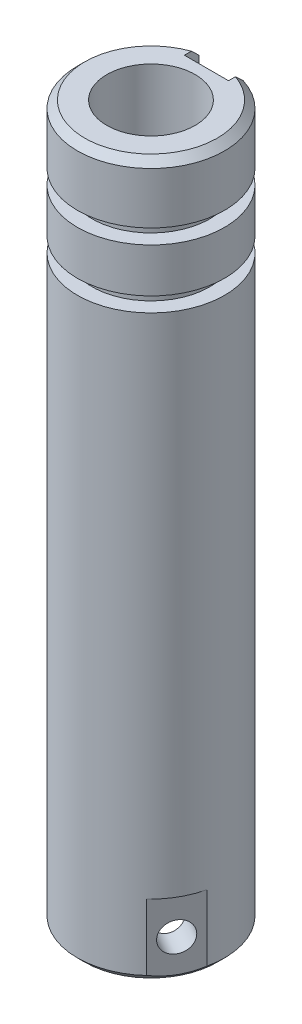
ISO-10303-21;
HEADER;
FILE_DESCRIPTION(('STEP AP214'),'2;1');
FILE_NAME('part.step','',(''),(''),'','','');
FILE_SCHEMA(('AUTOMOTIVE_DESIGN { 1 0 10303 214 1 1 1 1 }'));
ENDSEC;
DATA;
#1=APPLICATION_CONTEXT('core data for automotive mechanical design processes');
#2=APPLICATION_PROTOCOL_DEFINITION('international standard','automotive_design',2000,#1);
#3=PRODUCT_CONTEXT('',#1,'mechanical');
#4=PRODUCT('Part','Part','',(#3));
#5=PRODUCT_RELATED_PRODUCT_CATEGORY('part','',(#4));
#6=PRODUCT_DEFINITION_FORMATION('','',#4);
#7=PRODUCT_DEFINITION_CONTEXT('part definition',#1,'design');
#8=PRODUCT_DEFINITION('design','',#6,#7);
#9=PRODUCT_DEFINITION_SHAPE('','',#8);
#10=(LENGTH_UNIT() NAMED_UNIT(*) SI_UNIT(.MILLI.,.METRE.));
#11=(NAMED_UNIT(*) PLANE_ANGLE_UNIT() SI_UNIT($,.RADIAN.));
#12=(NAMED_UNIT(*) SI_UNIT($,.STERADIAN.) SOLID_ANGLE_UNIT());
#13=UNCERTAINTY_MEASURE_WITH_UNIT(LENGTH_MEASURE(1.E-05),#10,'distance_accuracy_value','');
#14=(GEOMETRIC_REPRESENTATION_CONTEXT(3) GLOBAL_UNCERTAINTY_ASSIGNED_CONTEXT((#13)) GLOBAL_UNIT_ASSIGNED_CONTEXT((#10,
#11,#12)) REPRESENTATION_CONTEXT('',''));
#15=CARTESIAN_POINT('',(0.,0.,0.));
#16=DIRECTION('',(0.,0.,1.));
#17=DIRECTION('',(1.,0.,0.));
#18=AXIS2_PLACEMENT_3D('',#15,#16,#17);
#19=CARTESIAN_POINT('',(0.,48.5,0.));
#20=DIRECTION('',(0.,-1.,0.));
#21=DIRECTION('',(0.,0.,-1.));
#22=AXIS2_PLACEMENT_3D('',#19,#20,#21);
#23=CYLINDRICAL_SURFACE('',#22,5.);
#24=DIRECTION('',(0.,1.,0.));
#25=VECTOR('',#24,1.);
#26=CARTESIAN_POINT('',(1.5,36.2575244156689,-4.76969600708473));
#27=LINE('',#26,#25);
#28=CARTESIAN_POINT('',(1.5,44.5,-4.76969600708473));
#29=VERTEX_POINT('',#28);
#30=CARTESIAN_POINT('',(1.5,48.,-4.76969600708473));
#31=VERTEX_POINT('',#30);
#32=EDGE_CURVE('E206',#29,#31,#27,.T.);
#33=ORIENTED_EDGE('',*,*,#32,.T.);
#34=CARTESIAN_POINT('',(0.,48.,0.));
#35=DIRECTION('',(0.,1.,0.));
#36=DIRECTION('',(0.,0.,1.));
#37=AXIS2_PLACEMENT_3D('',#34,#35,#36);
#38=CIRCLE('',#37,5.);
#39=CARTESIAN_POINT('',(-1.5,48.,-4.76969600708473));
#40=VERTEX_POINT('',#39);
#41=EDGE_CURVE('E47',#31,#40,#38,.F.);
#42=ORIENTED_EDGE('',*,*,#41,.T.);
#43=DIRECTION('',(0.,1.,0.));
#44=VECTOR('',#43,1.);
#45=CARTESIAN_POINT('',(-1.5,36.2575244156689,-4.76969600708473));
#46=LINE('',#45,#44);
#47=CARTESIAN_POINT('',(-1.5,44.5,-4.76969600708473));
#48=VERTEX_POINT('',#47);
#49=EDGE_CURVE('E209',#48,#40,#46,.T.);
#50=ORIENTED_EDGE('',*,*,#49,.F.);
#51=CARTESIAN_POINT('',(0.,44.5,0.));
#52=DIRECTION('',(0.,-1.,0.));
#53=DIRECTION('',(0.,0.,-1.));
#54=AXIS2_PLACEMENT_3D('',#51,#52,#53);
#55=CIRCLE('',#54,5.);
#56=EDGE_CURVE('E240',#29,#48,#55,.T.);
#57=ORIENTED_EDGE('',*,*,#56,.F.);
#58=EDGE_LOOP('',(#33,#42,#50,#57));
#59=FACE_BOUND('',#58,.T.);
#60=ADVANCED_FACE('F33',(#59),#23,.T.);
#61=CARTESIAN_POINT('',(0.,43.5,0.));
#62=DIRECTION('',(0.,-1.,0.));
#63=DIRECTION('',(0.,0.,-1.));
#64=AXIS2_PLACEMENT_3D('',#61,#62,#63);
#65=CIRCLE('',#64,5.);
#66=CARTESIAN_POINT('',(1.5,43.5,-4.76969600708473));
#67=VERTEX_POINT('',#66);
#68=CARTESIAN_POINT('',(-1.5,43.5,-4.76969600708473));
#69=VERTEX_POINT('',#68);
#70=EDGE_CURVE('E237',#67,#69,#65,.T.);
#71=ORIENTED_EDGE('',*,*,#70,.T.);
#72=CARTESIAN_POINT('',(-1.5,40.5,-4.76969600708473));
#73=VERTEX_POINT('',#72);
#74=EDGE_CURVE('E211',#73,#69,#46,.T.);
#75=ORIENTED_EDGE('',*,*,#74,.F.);
#76=CARTESIAN_POINT('',(0.,40.5,0.));
#77=DIRECTION('',(0.,-1.,0.));
#78=DIRECTION('',(0.,0.,-1.));
#79=AXIS2_PLACEMENT_3D('',#76,#77,#78);
#80=CIRCLE('',#79,5.);
#81=CARTESIAN_POINT('',(1.5,40.5,-4.76969600708473));
#82=VERTEX_POINT('',#81);
#83=EDGE_CURVE('E252',#82,#73,#80,.T.);
#84=ORIENTED_EDGE('',*,*,#83,.F.);
#85=EDGE_CURVE('E207',#82,#67,#27,.T.);
#86=ORIENTED_EDGE('',*,*,#85,.T.);
#87=EDGE_LOOP('',(#71,#75,#84,#86));
#88=FACE_BOUND('',#87,.T.);
#89=ADVANCED_FACE('F351',(#88),#23,.T.);
#90=CARTESIAN_POINT('',(0.,48.5,0.));
#91=DIRECTION('',(0.,1.,0.));
#92=DIRECTION('',(0.,0.,1.));
#93=AXIS2_PLACEMENT_3D('',#90,#91,#92);
#94=PLANE('',#93);
#95=DIRECTION('',(0.,0.,1.));
#96=VECTOR('',#95,1.);
#97=CARTESIAN_POINT('',(-1.5,48.5,-3.76969600708473));
#98=LINE('',#97,#96);
#99=CARTESIAN_POINT('',(-1.5,48.5,-4.24264068711931));
#100=VERTEX_POINT('',#99);
#101=CARTESIAN_POINT('',(-1.5,48.5,-3.76969600708473));
#102=VERTEX_POINT('',#101);
#103=EDGE_CURVE('E192',#100,#102,#98,.T.);
#104=ORIENTED_EDGE('',*,*,#103,.F.);
#105=CARTESIAN_POINT('',(0.,48.5,0.));
#106=DIRECTION('',(0.,1.,0.));
#107=DIRECTION('',(0.,0.,1.));
#108=AXIS2_PLACEMENT_3D('',#105,#106,#107);
#109=CIRCLE('',#108,4.50000000000002);
#110=CARTESIAN_POINT('',(1.5,48.5,-4.24264068711931));
#111=VERTEX_POINT('',#110);
#112=EDGE_CURVE('E198',#100,#111,#109,.T.);
#113=ORIENTED_EDGE('',*,*,#112,.T.);
#114=DIRECTION('',(0.,0.,-1.));
#115=VECTOR('',#114,1.);
#116=CARTESIAN_POINT('',(1.5,48.5,-3.76969600708473));
#117=LINE('',#116,#115);
#118=CARTESIAN_POINT('',(1.5,48.5,-3.76969600708473));
#119=VERTEX_POINT('',#118);
#120=EDGE_CURVE('E176',#119,#111,#117,.T.);
#121=ORIENTED_EDGE('',*,*,#120,.F.);
#122=DIRECTION('',(1.,0.,0.));
#123=VECTOR('',#122,1.);
#124=CARTESIAN_POINT('',(-1.5,48.5,-3.76969600708473));
#125=LINE('',#124,#123);
#126=EDGE_CURVE('E186',#102,#119,#125,.T.);
#127=ORIENTED_EDGE('',*,*,#126,.F.);
#128=EDGE_LOOP('',(#104,#113,#121,#127));
#129=FACE_BOUND('',#128,.T.);
#130=CARTESIAN_POINT('',(0.,48.5,0.));
#131=DIRECTION('',(0.,1.,0.));
#132=DIRECTION('',(0.,0.,1.));
#133=AXIS2_PLACEMENT_3D('',#130,#131,#132);
#134=CIRCLE('',#133,3.);
#135=CARTESIAN_POINT('',(0.,48.5,3.));
#136=VERTEX_POINT('',#135);
#137=EDGE_CURVE('E443',#136,#136,#134,.T.);
#138=ORIENTED_EDGE('',*,*,#137,.F.);
#139=EDGE_LOOP('',(#138));
#140=FACE_BOUND('',#139,.T.);
#141=ADVANCED_FACE('F195',(#129,#140),#94,.T.);
#142=CARTESIAN_POINT('',(0.,0.,0.));
#143=DIRECTION('',(0.,1.,0.));
#144=DIRECTION('',(0.,0.,1.));
#145=AXIS2_PLACEMENT_3D('',#142,#143,#144);
#146=PLANE('',#145);
#147=CARTESIAN_POINT('',(0.,0.,0.));
#148=DIRECTION('',(0.,1.,0.));
#149=DIRECTION('',(0.,0.,1.));
#150=AXIS2_PLACEMENT_3D('',#147,#148,#149);
#151=CIRCLE('',#150,4.49999999999998);
#152=CARTESIAN_POINT('',(4.3926101194181,0.,0.977228908079133));
#153=VERTEX_POINT('',#152);
#154=EDGE_CURVE('E52',#153,#153,#151,.F.);
#155=ORIENTED_EDGE('',*,*,#154,.T.);
#156=EDGE_LOOP('',(#155));
#157=FACE_BOUND('',#156,.T.);
#158=CARTESIAN_POINT('',(0.,0.,0.));
#159=DIRECTION('',(0.,1.,0.));
#160=DIRECTION('',(0.,0.,1.));
#161=AXIS2_PLACEMENT_3D('',#158,#159,#160);
#162=CIRCLE('',#161,3.);
#163=CARTESIAN_POINT('',(0.,0.,3.));
#164=VERTEX_POINT('',#163);
#165=EDGE_CURVE('E447',#164,#164,#162,.T.);
#166=ORIENTED_EDGE('',*,*,#165,.T.);
#167=EDGE_LOOP('',(#166));
#168=FACE_BOUND('',#167,.T.);
#169=ADVANCED_FACE('F350',(#157,#168),#146,.F.);
#170=CARTESIAN_POINT('',(0.,39.5,0.));
#171=DIRECTION('',(0.,-1.,0.));
#172=DIRECTION('',(0.,0.,-1.));
#173=AXIS2_PLACEMENT_3D('',#170,#171,#172);
#174=CIRCLE('',#173,5.);
#175=CARTESIAN_POINT('',(0.,39.5,-5.));
#176=VERTEX_POINT('',#175);
#177=EDGE_CURVE('E249',#176,#176,#174,.T.);
#178=ORIENTED_EDGE('',*,*,#177,.T.);
#179=EDGE_LOOP('',(#178));
#180=FACE_BOUND('',#179,.T.);
#181=DIRECTION('',(0.,-1.,0.));
#182=VECTOR('',#181,1.);
#183=CARTESIAN_POINT('',(4.88067791046458,5.,1.08580989786571));
#184=LINE('',#183,#182);
#185=CARTESIAN_POINT('',(4.88067791046458,5.,1.08580989786571));
#186=VERTEX_POINT('',#185);
#187=CARTESIAN_POINT('',(4.88067791046458,0.500000000000006,1.08580989786571));
#188=VERTEX_POINT('',#187);
#189=EDGE_CURVE('E437',#186,#188,#184,.T.);
#190=ORIENTED_EDGE('',*,*,#189,.T.);
#191=CARTESIAN_POINT('',(0.,0.500000000000021,0.));
#192=DIRECTION('',(0.,1.,0.));
#193=DIRECTION('',(0.,0.,1.));
#194=AXIS2_PLACEMENT_3D('',#191,#192,#193);
#195=CIRCLE('',#194,5.);
#196=CARTESIAN_POINT('',(1.5,0.500000000000022,-4.76969600708473));
#197=VERTEX_POINT('',#196);
#198=EDGE_CURVE('E387',#188,#197,#195,.T.);
#199=ORIENTED_EDGE('',*,*,#198,.T.);
#200=DIRECTION('',(0.,-1.,0.));
#201=VECTOR('',#200,1.);
#202=CARTESIAN_POINT('',(1.5,5.,-4.76969600708473));
#203=LINE('',#202,#201);
#204=CARTESIAN_POINT('',(1.5,5.,-4.76969600708473));
#205=VERTEX_POINT('',#204);
#206=EDGE_CURVE('E621',#205,#197,#203,.T.);
#207=ORIENTED_EDGE('',*,*,#206,.F.);
#208=CARTESIAN_POINT('',(0.,5.,0.));
#209=DIRECTION('',(0.,-1.,0.));
#210=DIRECTION('',(0.,0.,-1.));
#211=AXIS2_PLACEMENT_3D('',#208,#209,#210);
#212=CIRCLE('',#211,5.);
#213=CARTESIAN_POINT('',(-1.5,5.,-4.76969600708473));
#214=VERTEX_POINT('',#213);
#215=EDGE_CURVE('E269',#214,#205,#212,.T.);
#216=ORIENTED_EDGE('',*,*,#215,.F.);
#217=DIRECTION('',(0.,-1.,0.));
#218=VECTOR('',#217,1.);
#219=CARTESIAN_POINT('',(-1.5,5.,-4.76969600708473));
#220=LINE('',#219,#218);
#221=CARTESIAN_POINT('',(-1.5,0.500000000000026,-4.76969600708473));
#222=VERTEX_POINT('',#221);
#223=EDGE_CURVE('E450',#214,#222,#220,.T.);
#224=ORIENTED_EDGE('',*,*,#223,.T.);
#225=CARTESIAN_POINT('',(0.,0.500000000000021,0.));
#226=DIRECTION('',(0.,1.,0.));
#227=DIRECTION('',(0.,0.,1.));
#228=AXIS2_PLACEMENT_3D('',#225,#226,#227);
#229=CIRCLE('',#228,5.);
#230=CARTESIAN_POINT('',(-4.88067791046458,0.500000000000022,1.08580989786571));
#231=VERTEX_POINT('',#230);
#232=EDGE_CURVE('E380',#222,#231,#229,.T.);
#233=ORIENTED_EDGE('',*,*,#232,.T.);
#234=DIRECTION('',(0.,-1.,0.));
#235=VECTOR('',#234,1.);
#236=CARTESIAN_POINT('',(-4.88067791046458,5.,1.08580989786571));
#237=LINE('',#236,#235);
#238=CARTESIAN_POINT('',(-4.88067791046458,5.,1.08580989786571));
#239=VERTEX_POINT('',#238);
#240=EDGE_CURVE('E415',#239,#231,#237,.T.);
#241=ORIENTED_EDGE('',*,*,#240,.F.);
#242=CARTESIAN_POINT('',(0.,5.,0.));
#243=DIRECTION('',(0.,-1.,0.));
#244=DIRECTION('',(0.,0.,-1.));
#245=AXIS2_PLACEMENT_3D('',#242,#243,#244);
#246=CIRCLE('',#245,5.);
#247=CARTESIAN_POINT('',(-3.38067791046458,5.,3.68388610921902));
#248=VERTEX_POINT('',#247);
#249=EDGE_CURVE('E439',#248,#239,#246,.T.);
#250=ORIENTED_EDGE('',*,*,#249,.F.);
#251=DIRECTION('',(0.,-1.,0.));
#252=VECTOR('',#251,1.);
#253=CARTESIAN_POINT('',(-3.38067791046458,5.,3.68388610921902));
#254=LINE('',#253,#252);
#255=CARTESIAN_POINT('',(-3.38067791046458,0.500000000000026,3.68388610921902));
#256=VERTEX_POINT('',#255);
#257=EDGE_CURVE('E421',#248,#256,#254,.T.);
#258=ORIENTED_EDGE('',*,*,#257,.T.);
#259=CARTESIAN_POINT('',(0.,0.500000000000021,0.));
#260=DIRECTION('',(0.,1.,0.));
#261=DIRECTION('',(0.,0.,1.));
#262=AXIS2_PLACEMENT_3D('',#259,#260,#261);
#263=CIRCLE('',#262,5.);
#264=CARTESIAN_POINT('',(3.38067791046458,0.500000000000022,3.68388610921902));
#265=VERTEX_POINT('',#264);
#266=EDGE_CURVE('E378',#256,#265,#263,.T.);
#267=ORIENTED_EDGE('',*,*,#266,.T.);
#268=DIRECTION('',(0.,-1.,0.));
#269=VECTOR('',#268,1.);
#270=CARTESIAN_POINT('',(3.38067791046458,5.,3.68388610921902));
#271=LINE('',#270,#269);
#272=CARTESIAN_POINT('',(3.38067791046458,5.,3.68388610921902));
#273=VERTEX_POINT('',#272);
#274=EDGE_CURVE('E432',#273,#265,#271,.T.);
#275=ORIENTED_EDGE('',*,*,#274,.F.);
#276=CARTESIAN_POINT('',(0.,5.,0.));
#277=DIRECTION('',(0.,-1.,0.));
#278=DIRECTION('',(0.,0.,-1.));
#279=AXIS2_PLACEMENT_3D('',#276,#277,#278);
#280=CIRCLE('',#279,5.);
#281=EDGE_CURVE('E268',#186,#273,#280,.T.);
#282=ORIENTED_EDGE('',*,*,#281,.F.);
#283=EDGE_LOOP('',(#190,#199,#207,#216,#224,#233,#241,#250,#258,#267,#275,#282));
#284=FACE_BOUND('',#283,.T.);
#285=ADVANCED_FACE('F346',(#180,#284),#23,.T.);
#286=CARTESIAN_POINT('',(0.,48.5,0.));
#287=DIRECTION('',(0.,-1.,0.));
#288=DIRECTION('',(0.,0.,-1.));
#289=AXIS2_PLACEMENT_3D('',#286,#287,#288);
#290=CYLINDRICAL_SURFACE('',#289,3.);
#291=CARTESIAN_POINT('',(2.94948974278318,2.5,0.548188158588678));
#292=CARTESIAN_POINT('',(2.9494897163758,2.55446817481068,0.548187845489906));
#293=CARTESIAN_POINT('',(2.94863460777702,2.60893479977153,0.552850433830417));
#294=CARTESIAN_POINT('',(2.94512580780031,2.71625442095062,0.571243949699136));
#295=CARTESIAN_POINT('',(2.94247182014978,2.76910714986394,0.58497637100532));
#296=CARTESIAN_POINT('',(2.93512644532741,2.87162689301282,0.620775943331657));
#297=CARTESIAN_POINT('',(2.93043904875564,2.92129992944688,0.642826758364247));
#298=CARTESIAN_POINT('',(2.91867304146506,3.0163600485438,0.6942924418411));
#299=CARTESIAN_POINT('',(2.91159390305356,3.0617461825525,0.72370893501212));
#300=CARTESIAN_POINT('',(2.89433716169468,3.14871996233949,0.789950769821897));
#301=CARTESIAN_POINT('',(2.88405843474758,3.19011542867205,0.827002155902409));
#302=CARTESIAN_POINT('',(2.86006833939889,3.26620680122433,0.906493619072153));
#303=CARTESIAN_POINT('',(2.84635642057039,3.30090163158229,0.948934559704175));
#304=CARTESIAN_POINT('',(2.81475946403735,3.36347889732969,1.03897093563514));
#305=CARTESIAN_POINT('',(2.79677487904781,3.39115997061799,1.08667196618825));
#306=CARTESIAN_POINT('',(2.75670792848228,3.43759158512749,1.18463354166115));
#307=CARTESIAN_POINT('',(2.73462666951358,3.4563445331769,1.23489339272985));
#308=CARTESIAN_POINT('',(2.68740607589497,3.4837358546324,1.33445764461856));
#309=CARTESIAN_POINT('',(2.66239987310221,3.49270344625701,1.3837344452732));
#310=CARTESIAN_POINT('',(2.60930280701353,3.50131629336066,1.48142713028547));
#311=CARTESIAN_POINT('',(2.58121274064173,3.50096395165242,1.52984323332224));
#312=CARTESIAN_POINT('',(2.52397868217758,3.49115574543397,1.62246147762239));
#313=CARTESIAN_POINT('',(2.49491923644684,3.48205747152549,1.66675441679583));
#314=CARTESIAN_POINT('',(2.43577085997886,3.45560701901955,1.75206046171515));
#315=CARTESIAN_POINT('',(2.40568185959739,3.43825428102025,1.79307334495283));
#316=CARTESIAN_POINT('',(2.34521043416665,3.39557868269387,1.87148977944853));
#317=CARTESIAN_POINT('',(2.31482935063307,3.37015406145322,1.90883880433723));
#318=CARTESIAN_POINT('',(2.2553902737191,3.31214029455161,1.97871731579513));
#319=CARTESIAN_POINT('',(2.22633265096383,3.27954915667336,2.0112454579915));
#320=CARTESIAN_POINT('',(2.16946724175734,3.20632560653926,2.07249634893776));
#321=CARTESIAN_POINT('',(2.14178271103917,3.16538684215456,2.10096782916087));
#322=CARTESIAN_POINT('',(2.09062062077154,3.07755127427734,2.15188557037472));
#323=CARTESIAN_POINT('',(2.06714370970325,3.03065355428676,2.17433090287655));
#324=CARTESIAN_POINT('',(2.02544969289186,2.93134637438458,2.21322872644712));
#325=CARTESIAN_POINT('',(2.00731234459531,2.87886786863219,2.22959121927714));
#326=CARTESIAN_POINT('',(1.97799766744652,2.77042860573374,2.25564056029587));
#327=CARTESIAN_POINT('',(1.96681742176086,2.71446931877817,2.26533020632302));
#328=CARTESIAN_POINT('',(1.95259489686749,2.60336164459938,2.27759915806719));
#329=CARTESIAN_POINT('',(1.94920822219128,2.54829057525427,2.28047953093647));
#330=CARTESIAN_POINT('',(1.94980791690728,2.43822385088296,2.27996706417256));
#331=CARTESIAN_POINT('',(1.9537929471419,2.38322818397524,2.27657536393583));
#332=CARTESIAN_POINT('',(1.96857277071254,2.27684303428883,2.26380430451681));
#333=CARTESIAN_POINT('',(1.97912894092661,2.22539456984936,2.25463462839699));
#334=CARTESIAN_POINT('',(2.00614121252133,2.12545639376061,2.23063256618061));
#335=CARTESIAN_POINT('',(2.02259835981342,2.07696720840917,2.21579917619579));
#336=CARTESIAN_POINT('',(2.0610588246965,1.98261957915306,2.1800789501518));
#337=CARTESIAN_POINT('',(2.08322149820636,1.93689335735821,2.159015034999));
#338=CARTESIAN_POINT('',(2.13161645501793,1.85085394761627,2.11124737227876));
#339=CARTESIAN_POINT('',(2.15784993755614,1.81054236133878,2.08454196191942));
#340=CARTESIAN_POINT('',(2.21446561348158,1.73447201590937,2.02433381859258));
#341=CARTESIAN_POINT('',(2.24498668449585,1.69902560998115,1.99056587169548));
#342=CARTESIAN_POINT('',(2.3076560150813,1.63608385765196,1.91755956774945));
#343=CARTESIAN_POINT('',(2.33980421680876,1.60858822883758,1.87832140507722));
#344=CARTESIAN_POINT('',(2.40405751733902,1.56257989513829,1.79533835186298));
#345=CARTESIAN_POINT('',(2.43616148347104,1.54400872285194,1.75162513527642));
#346=CARTESIAN_POINT('',(2.49915841075209,1.5162722579399,1.66050287316978));
#347=CARTESIAN_POINT('',(2.53005180515471,1.5071035701195,1.61309516837105));
#348=CARTESIAN_POINT('',(2.58803108968412,1.49873792239436,1.5182359258244));
#349=CARTESIAN_POINT('',(2.61522768888872,1.49909254606763,1.47089117127264));
#350=CARTESIAN_POINT('',(2.66663933259839,1.50865730814641,1.37548912086595));
#351=CARTESIAN_POINT('',(2.69085461880081,1.51786672815277,1.32743188312696));
#352=CARTESIAN_POINT('',(2.7354612239118,1.54458223457597,1.23286047713863));
#353=CARTESIAN_POINT('',(2.7559071723969,1.56195421535295,1.18633392368868));
#354=CARTESIAN_POINT('',(2.79328875439693,1.60437753109714,1.09542517126302));
#355=CARTESIAN_POINT('',(2.81022375199486,1.62943025519695,1.05104336186609));
#356=CARTESIAN_POINT('',(2.84123418687188,1.68756951210208,0.964155408696281));
#357=CARTESIAN_POINT('',(2.85518084480231,1.72091868538192,0.921779161852597));
#358=CARTESIAN_POINT('',(2.87969384632043,1.79425739115592,0.842083723758077));
#359=CARTESIAN_POINT('',(2.89025910825836,1.83424904226169,0.804766152885756));
#360=CARTESIAN_POINT('',(2.90876823911907,1.92160935558804,0.735131218950424));
#361=CARTESIAN_POINT('',(2.91659330371146,1.96920551098077,0.703066772863495));
#362=CARTESIAN_POINT('',(2.92951111588396,2.06933442689866,0.647141772277267));
#363=CARTESIAN_POINT('',(2.93460457755776,2.12186589301425,0.623279074269161));
#364=CARTESIAN_POINT('',(2.94231164103028,2.22796182402384,0.585793430644911));
#365=CARTESIAN_POINT('',(2.94502692981434,2.28137226356572,0.571756386798984));
#366=CARTESIAN_POINT('',(2.94861567625516,2.38985605051548,0.552955509010799));
#367=CARTESIAN_POINT('',(2.9494897694829,2.44492881743575,0.548188475153714));
#368=CARTESIAN_POINT('',(2.94948974278318,2.5,0.548188158588678));
#369=B_SPLINE_CURVE_WITH_KNOTS('',3,(#291,#292,#293,#294,#295,#296,#297,#298,#299,#300,#301,
#302,#303,#304,#305,#306,#307,#308,#309,#310,#311,#312,#313,#314,#315,#316,#317,#318,#319,#320,
#321,#322,#323,#324,#325,#326,#327,#328,#329,#330,#331,#332,#333,#334,#335,#336,#337,#338,#339,
#340,#341,#342,#343,#344,#345,#346,#347,#348,#349,#350,#351,#352,#353,#354,#355,#356,#357,#358,
#359,#360,#361,#362,#363,#364,#365,#366,#367,#368),.UNSPECIFIED.,.T.,.F.,(4,2,2,2,2,2,2,2,2,2,2,
2,2,2,2,2,2,2,2,2,2,2,2,2,2,2,2,2,2,2,2,2,2,2,2,2,2,2,4),(0.,0.163200584775418,
0.326428054968882,0.489336627454546,0.652281166139161,0.821013374229401,0.9897726516736,
1.16293506139029,1.33605076382161,1.50314318760306,1.67019253297699,1.83069004820941,
1.99119844184608,2.15381654855707,2.31647991869394,2.48680174359289,2.65714979607478,
2.82992639837376,3.00263051349689,3.16754291357513,3.33242535830307,3.49164395761849,
3.65089079140019,3.81518857728788,3.979534856552,4.15178808164165,4.32403518750605,
4.49513791183924,4.66617882997229,4.82918084670708,4.99216964002854,5.15256956033503,
5.31299850756316,5.47935519513707,5.64576504425705,5.81868902729217,5.99156778259939,
6.15663212153686,6.32163947179229),.UNSPECIFIED.);
#370=CARTESIAN_POINT('',(2.94948974278318,2.5,0.548188158588678));
#371=VERTEX_POINT('',#370);
#372=EDGE_CURVE('E260',#371,#371,#369,.T.);
#373=ORIENTED_EDGE('',*,*,#372,.T.);
#374=EDGE_LOOP('',(#373));
#375=FACE_BOUND('',#374,.T.);
#376=ORIENTED_EDGE('',*,*,#137,.T.);
#377=EDGE_LOOP('',(#376));
#378=FACE_BOUND('',#377,.T.);
#379=ORIENTED_EDGE('',*,*,#165,.F.);
#380=EDGE_LOOP('',(#379));
#381=FACE_BOUND('',#380,.T.);
#382=ADVANCED_FACE('F342',(#375,#378,#381),#290,.F.);
#383=CARTESIAN_POINT('',(4.88067791046458,5.,1.08580989786571));
#384=DIRECTION('',(-0.866025403784438,0.,-0.5));
#385=DIRECTION('',(-0.5,0.,0.866025403784438));
#386=AXIS2_PLACEMENT_3D('',#383,#384,#385);
#387=PLANE('',#386);
#388=CARTESIAN_POINT('',(4.13067791046458,2.5,2.38484800354237));
#389=DIRECTION('',(0.866025403784443,0.,0.499999999999992));
#390=DIRECTION('',(0.499999999999992,0.,-0.866025403784443));
#391=AXIS2_PLACEMENT_3D('',#388,#389,#390);
#392=CIRCLE('',#391,1.);
#393=CARTESIAN_POINT('',(4.63067791046457,2.5,1.51882259975792));
#394=VERTEX_POINT('',#393);
#395=EDGE_CURVE('E255',#394,#394,#392,.T.);
#396=ORIENTED_EDGE('',*,*,#395,.F.);
#397=EDGE_LOOP('',(#396));
#398=FACE_BOUND('',#397,.T.);
#399=ORIENTED_EDGE('',*,*,#274,.T.);
#400=CARTESIAN_POINT('',(3.38067791046458,0.500000000000022,3.68388610921902));
#401=CARTESIAN_POINT('',(3.44050201238633,0.464075400264835,3.58026772517336));
#402=CARTESIAN_POINT('',(3.50089964868762,0.431772412149494,3.47565595044247));
#403=CARTESIAN_POINT('',(3.62269466194985,0.375266139328449,3.26470079936376));
#404=CARTESIAN_POINT('',(3.68409298513864,0.351071050617097,3.15835578410123));
#405=CARTESIAN_POINT('',(3.80617739307441,0.312172883282559,2.94689938674452));
#406=CARTESIAN_POINT('',(3.86684659656931,0.297261217260202,2.84181724383662));
#407=CARTESIAN_POINT('',(3.98854619569251,0.27662116752704,2.63102735489448));
#408=CARTESIAN_POINT('',(4.04957640366675,0.27088837263935,2.52531993388659));
#409=CARTESIAN_POINT('',(4.18336345788209,0.268644830224302,2.29359395859066));
#410=CARTESIAN_POINT('',(4.25613066424724,0.274107567941672,2.16755746004137));
#411=CARTESIAN_POINT('',(4.40117915796418,0.298097936504097,1.91632609936229));
#412=CARTESIAN_POINT('',(4.47345995460687,0.316637203551398,1.7911320871656));
#413=CARTESIAN_POINT('',(4.61901553325235,0.366493700552149,1.53902242962653));
#414=CARTESIAN_POINT('',(4.69225974528993,0.398160749563621,1.4121597330171));
#415=CARTESIAN_POINT('',(4.83719731473596,0.47262054755676,1.16112049881104));
#416=CARTESIAN_POINT('',(4.90889308956307,0.515394354805008,1.03693977412247));
#417=CARTESIAN_POINT('',(4.97972232879343,0.562954246009114,0.914259933114038));
#418=B_SPLINE_CURVE_WITH_KNOTS('',3,(#400,#401,#402,#403,#404,#405,#406,#407,#408,#409,#410,
#411,#412,#413,#414,#415,#416,#417),.UNSPECIFIED.,.F.,.F.,(4,2,2,2,2,2,2,2,4),(0.,
0.374804041419942,0.749985824325114,1.11640080084379,1.48263963294129,1.91892429686582,
2.35559768104312,2.80474254754903,3.25312640572162),.UNSPECIFIED.);
#419=EDGE_CURVE('E320',#265,#188,#418,.T.);
#420=ORIENTED_EDGE('',*,*,#419,.T.);
#421=ORIENTED_EDGE('',*,*,#189,.F.);
#422=DIRECTION('',(0.5,0.,-0.866025403784438));
#423=VECTOR('',#422,1.);
#424=CARTESIAN_POINT('',(4.88067791046458,5.,1.08580989786571));
#425=LINE('',#424,#423);
#426=EDGE_CURVE('E436',#273,#186,#425,.T.);
#427=ORIENTED_EDGE('',*,*,#426,.F.);
#428=EDGE_LOOP('',(#399,#420,#421,#427));
#429=FACE_BOUND('',#428,.T.);
#430=ADVANCED_FACE('F336',(#398,#429),#387,.F.);
#431=CARTESIAN_POINT('',(0.,5.,0.));
#432=DIRECTION('',(0.,-1.,0.));
#433=DIRECTION('',(0.,0.,-1.));
#434=AXIS2_PLACEMENT_3D('',#431,#432,#433);
#435=PLANE('',#434);
#436=ORIENTED_EDGE('',*,*,#281,.T.);
#437=ORIENTED_EDGE('',*,*,#426,.T.);
#438=EDGE_LOOP('',(#436,#437));
#439=FACE_BOUND('',#438,.T.);
#440=ADVANCED_FACE('F341',(#439),#435,.T.);
#441=CARTESIAN_POINT('',(-3.38067791046458,5.,3.68388610921902));
#442=DIRECTION('',(0.866025403784439,0.,-0.5));
#443=DIRECTION('',(-0.5,0.,-0.866025403784439));
#444=AXIS2_PLACEMENT_3D('',#441,#442,#443);
#445=PLANE('',#444);
#446=ORIENTED_EDGE('',*,*,#240,.T.);
#447=CARTESIAN_POINT('',(-4.88067791046458,0.500000000000022,1.08580989786571));
#448=CARTESIAN_POINT('',(-4.82085380854282,0.464075400264835,1.18942828191137));
#449=CARTESIAN_POINT('',(-4.76045617224154,0.431772412149494,1.29404005664226));
#450=CARTESIAN_POINT('',(-4.63866115897931,0.375266139328449,1.50499520772097));
#451=CARTESIAN_POINT('',(-4.57726283579051,0.351071050617098,1.6113402229835));
#452=CARTESIAN_POINT('',(-4.45517842785474,0.31217288328256,1.82279662034021));
#453=CARTESIAN_POINT('',(-4.39450922435984,0.297261217260202,1.92787876324811));
#454=CARTESIAN_POINT('',(-4.27280962523665,0.27662116752704,2.13866865219025));
#455=CARTESIAN_POINT('',(-4.2117794172624,0.27088837263935,2.24437607319814));
#456=CARTESIAN_POINT('',(-4.07799236304707,0.268644830224302,2.47610204849407));
#457=CARTESIAN_POINT('',(-4.00522515668192,0.274107567941672,2.60213854704336));
#458=CARTESIAN_POINT('',(-3.86017666296497,0.298097936504097,2.85336990772244));
#459=CARTESIAN_POINT('',(-3.78789586632229,0.316637203551398,2.97856391991913));
#460=CARTESIAN_POINT('',(-3.6423402876768,0.366493700552149,3.2306735774582));
#461=CARTESIAN_POINT('',(-3.56909607563922,0.398160749563621,3.35753627406763));
#462=CARTESIAN_POINT('',(-3.4241585061932,0.47262054755676,3.60857550827369));
#463=CARTESIAN_POINT('',(-3.35246273136609,0.515394354805008,3.73275623296226));
#464=CARTESIAN_POINT('',(-3.28163349213573,0.562954246009113,3.85543607397069));
#465=B_SPLINE_CURVE_WITH_KNOTS('',3,(#447,#448,#449,#450,#451,#452,#453,#454,#455,#456,#457,
#458,#459,#460,#461,#462,#463,#464),.UNSPECIFIED.,.F.,.F.,(4,2,2,2,2,2,2,2,4),(0.,
0.374804041419941,0.749985824325114,1.11640080084379,1.48263963294129,1.91892429686582,
2.35559768104312,2.80474254754903,3.25312640572162),.UNSPECIFIED.);
#466=EDGE_CURVE('E327',#231,#256,#465,.T.);
#467=ORIENTED_EDGE('',*,*,#466,.T.);
#468=ORIENTED_EDGE('',*,*,#257,.F.);
#469=DIRECTION('',(0.5,0.,0.866025403784439));
#470=VECTOR('',#469,1.);
#471=CARTESIAN_POINT('',(-3.38067791046458,5.,3.68388610921902));
#472=LINE('',#471,#470);
#473=EDGE_CURVE('E419',#239,#248,#472,.T.);
#474=ORIENTED_EDGE('',*,*,#473,.F.);
#475=EDGE_LOOP('',(#446,#467,#468,#474));
#476=FACE_BOUND('',#475,.T.);
#477=ADVANCED_FACE('F403',(#476),#445,.F.);
#478=CARTESIAN_POINT('',(0.,5.,0.));
#479=DIRECTION('',(0.,-1.,0.));
#480=DIRECTION('',(0.,0.,-1.));
#481=AXIS2_PLACEMENT_3D('',#478,#479,#480);
#482=PLANE('',#481);
#483=ORIENTED_EDGE('',*,*,#249,.T.);
#484=ORIENTED_EDGE('',*,*,#473,.T.);
#485=EDGE_LOOP('',(#483,#484));
#486=FACE_BOUND('',#485,.T.);
#487=ADVANCED_FACE('F400',(#486),#482,.T.);
#488=CARTESIAN_POINT('',(-1.5,5.,-4.76969600708473));
#489=DIRECTION('',(0.,0.,1.));
#490=DIRECTION('',(1.,0.,0.));
#491=AXIS2_PLACEMENT_3D('',#488,#489,#490);
#492=PLANE('',#491);
#493=ORIENTED_EDGE('',*,*,#206,.T.);
#494=CARTESIAN_POINT('',(1.5,0.500000000000022,-4.76969600708473));
#495=CARTESIAN_POINT('',(1.38035179615648,0.464075400264836,-4.76969600708473));
#496=CARTESIAN_POINT('',(1.25955652355391,0.431772412149494,-4.76969600708473));
#497=CARTESIAN_POINT('',(1.01596649702946,0.375266139328449,-4.76969600708473));
#498=CARTESIAN_POINT('',(0.893169850651862,0.351071050617097,-4.76969600708473));
#499=CARTESIAN_POINT('',(0.649001034780327,0.312172883282559,-4.76969600708473));
#500=CARTESIAN_POINT('',(0.527662627790529,0.297261217260202,-4.76969600708473));
#501=CARTESIAN_POINT('',(0.284263429544136,0.276621167527039,-4.76969600708473));
#502=CARTESIAN_POINT('',(0.162203013595644,0.27088837263935,-4.76969600708473));
#503=CARTESIAN_POINT('',(-0.105371094835018,0.268644830224301,-4.76969600708473));
#504=CARTESIAN_POINT('',(-0.250905507565323,0.274107567941672,-4.76969600708473));
#505=CARTESIAN_POINT('',(-0.54100249499921,0.298097936504096,-4.76969600708473));
#506=CARTESIAN_POINT('',(-0.685564088284583,0.316637203551398,-4.76969600708473));
#507=CARTESIAN_POINT('',(-0.976675245575554,0.366493700552149,-4.76969600708473));
#508=CARTESIAN_POINT('',(-1.12316366965071,0.398160749563621,-4.76969600708473));
#509=CARTESIAN_POINT('',(-1.41303880854276,0.47262054755676,-4.76969600708473));
#510=CARTESIAN_POINT('',(-1.55643035819698,0.515394354805007,-4.76969600708473));
#511=CARTESIAN_POINT('',(-1.6980888366577,0.562954246009113,-4.76969600708473));
#512=B_SPLINE_CURVE_WITH_KNOTS('',3,(#494,#495,#496,#497,#498,#499,#500,#501,#502,#503,#504,
#505,#506,#507,#508,#509,#510,#511),.UNSPECIFIED.,.F.,.F.,(4,2,2,2,2,2,2,2,4),(0.,
0.374804041419942,0.749985824325114,1.11640080084379,1.48263963294129,1.91892429686582,
2.35559768104312,2.80474254754903,3.25312640572162),.UNSPECIFIED.);
#513=EDGE_CURVE('E389',#197,#222,#512,.T.);
#514=ORIENTED_EDGE('',*,*,#513,.T.);
#515=ORIENTED_EDGE('',*,*,#223,.F.);
#516=DIRECTION('',(-1.,0.,0.));
#517=VECTOR('',#516,1.);
#518=CARTESIAN_POINT('',(-1.5,5.,-4.76969600708473));
#519=LINE('',#518,#517);
#520=EDGE_CURVE('E616',#205,#214,#519,.T.);
#521=ORIENTED_EDGE('',*,*,#520,.F.);
#522=EDGE_LOOP('',(#493,#514,#515,#521));
#523=FACE_BOUND('',#522,.T.);
#524=ADVANCED_FACE('F395',(#523),#492,.F.);
#525=CARTESIAN_POINT('',(0.,5.,0.));
#526=DIRECTION('',(0.,-1.,0.));
#527=DIRECTION('',(0.,0.,-1.));
#528=AXIS2_PLACEMENT_3D('',#525,#526,#527);
#529=PLANE('',#528);
#530=ORIENTED_EDGE('',*,*,#215,.T.);
#531=ORIENTED_EDGE('',*,*,#520,.T.);
#532=EDGE_LOOP('',(#530,#531));
#533=FACE_BOUND('',#532,.T.);
#534=ADVANCED_FACE('F399',(#533),#529,.T.);
#535=CARTESIAN_POINT('',(-5.91624652216303,2.5,-3.41574652216289));
#536=DIRECTION('',(0.866025403784443,0.,0.499999999999992));
#537=DIRECTION('',(0.499999999999992,0.,-0.866025403784443));
#538=AXIS2_PLACEMENT_3D('',#535,#536,#537);
#539=CYLINDRICAL_SURFACE('',#538,1.);
#540=ORIENTED_EDGE('',*,*,#395,.T.);
#541=EDGE_LOOP('',(#540));
#542=FACE_BOUND('',#541,.T.);
#543=ORIENTED_EDGE('',*,*,#372,.F.);
#544=EDGE_LOOP('',(#543));
#545=FACE_BOUND('',#544,.T.);
#546=ADVANCED_FACE('F271',(#542,#545),#539,.F.);
#547=CARTESIAN_POINT('',(0.,40.5,0.));
#548=DIRECTION('',(0.,-1.,0.));
#549=DIRECTION('',(0.,0.,-1.));
#550=AXIS2_PLACEMENT_3D('',#547,#548,#549);
#551=PLANE('',#550);
#552=DIRECTION('',(0.,0.,-1.));
#553=VECTOR('',#552,1.);
#554=CARTESIAN_POINT('',(-1.5,40.5,0.));
#555=LINE('',#554,#553);
#556=CARTESIAN_POINT('',(-1.5,40.5,-3.76969600708473));
#557=VERTEX_POINT('',#556);
#558=EDGE_CURVE('E231',#557,#73,#555,.T.);
#559=ORIENTED_EDGE('',*,*,#558,.F.);
#560=DIRECTION('',(-1.,0.,0.));
#561=VECTOR('',#560,1.);
#562=CARTESIAN_POINT('',(0.,40.5,-3.76969600708473));
#563=LINE('',#562,#561);
#564=CARTESIAN_POINT('',(-1.33768158175608,40.5,-3.76969600708473));
#565=VERTEX_POINT('',#564);
#566=EDGE_CURVE('E224',#565,#557,#563,.T.);
#567=ORIENTED_EDGE('',*,*,#566,.F.);
#568=CARTESIAN_POINT('',(0.,40.5,0.));
#569=DIRECTION('',(0.,-1.,0.));
#570=DIRECTION('',(0.,0.,-1.));
#571=AXIS2_PLACEMENT_3D('',#568,#569,#570);
#572=CIRCLE('',#571,4.);
#573=CARTESIAN_POINT('',(1.33768158175608,40.5,-3.76969600708473));
#574=VERTEX_POINT('',#573);
#575=EDGE_CURVE('E246',#574,#565,#572,.T.);
#576=ORIENTED_EDGE('',*,*,#575,.F.);
#577=CARTESIAN_POINT('',(1.5,40.5,-3.76969600708473));
#578=VERTEX_POINT('',#577);
#579=EDGE_CURVE('E221',#578,#574,#563,.T.);
#580=ORIENTED_EDGE('',*,*,#579,.F.);
#581=DIRECTION('',(0.,0.,1.));
#582=VECTOR('',#581,1.);
#583=CARTESIAN_POINT('',(1.5,40.5,0.));
#584=LINE('',#583,#582);
#585=EDGE_CURVE('E227',#82,#578,#584,.T.);
#586=ORIENTED_EDGE('',*,*,#585,.F.);
#587=ORIENTED_EDGE('',*,*,#83,.T.);
#588=EDGE_LOOP('',(#559,#567,#576,#580,#586,#587));
#589=FACE_BOUND('',#588,.T.);
#590=ADVANCED_FACE('F280',(#589),#551,.T.);
#591=CARTESIAN_POINT('',(0.,39.5,0.));
#592=DIRECTION('',(0.,-1.,0.));
#593=DIRECTION('',(0.,0.,-1.));
#594=AXIS2_PLACEMENT_3D('',#591,#592,#593);
#595=PLANE('',#594);
#596=ORIENTED_EDGE('',*,*,#177,.F.);
#597=EDGE_LOOP('',(#596));
#598=FACE_BOUND('',#597,.T.);
#599=DIRECTION('',(1.,0.,0.));
#600=VECTOR('',#599,1.);
#601=CARTESIAN_POINT('',(-1.5,39.5,-3.76969600708473));
#602=LINE('',#601,#600);
#603=CARTESIAN_POINT('',(-1.33768158175608,39.5,-3.76969600708473));
#604=VERTEX_POINT('',#603);
#605=CARTESIAN_POINT('',(1.33768158175608,39.5,-3.76969600708473));
#606=VERTEX_POINT('',#605);
#607=EDGE_CURVE('E182',#604,#606,#602,.T.);
#608=ORIENTED_EDGE('',*,*,#607,.T.);
#609=CARTESIAN_POINT('',(0.,39.5,0.));
#610=DIRECTION('',(0.,-1.,0.));
#611=DIRECTION('',(0.,0.,-1.));
#612=AXIS2_PLACEMENT_3D('',#609,#610,#611);
#613=CIRCLE('',#612,4.);
#614=EDGE_CURVE('E243',#606,#604,#613,.T.);
#615=ORIENTED_EDGE('',*,*,#614,.T.);
#616=EDGE_LOOP('',(#608,#615));
#617=FACE_BOUND('',#616,.T.);
#618=ADVANCED_FACE('F276',(#598,#617),#595,.F.);
#619=CARTESIAN_POINT('',(0.,40.5,0.));
#620=DIRECTION('',(0.,-1.,0.));
#621=DIRECTION('',(0.,0.,-1.));
#622=AXIS2_PLACEMENT_3D('',#619,#620,#621);
#623=CYLINDRICAL_SURFACE('',#622,4.);
#624=DIRECTION('',(0.,-1.,0.));
#625=VECTOR('',#624,1.);
#626=CARTESIAN_POINT('',(-1.33768158175608,40.5,-3.76969600708473));
#627=LINE('',#626,#625);
#628=EDGE_CURVE('E223',#604,#565,#627,.F.);
#629=ORIENTED_EDGE('',*,*,#628,.F.);
#630=ORIENTED_EDGE('',*,*,#614,.F.);
#631=DIRECTION('',(0.,-1.,0.));
#632=VECTOR('',#631,1.);
#633=CARTESIAN_POINT('',(1.33768158175608,40.5,-3.76969600708473));
#634=LINE('',#633,#632);
#635=EDGE_CURVE('E219',#574,#606,#634,.T.);
#636=ORIENTED_EDGE('',*,*,#635,.F.);
#637=ORIENTED_EDGE('',*,*,#575,.T.);
#638=EDGE_LOOP('',(#629,#630,#636,#637));
#639=FACE_BOUND('',#638,.T.);
#640=ADVANCED_FACE('F279',(#639),#623,.T.);
#641=CARTESIAN_POINT('',(0.,44.5,0.));
#642=DIRECTION('',(0.,-1.,0.));
#643=DIRECTION('',(0.,0.,-1.));
#644=AXIS2_PLACEMENT_3D('',#641,#642,#643);
#645=PLANE('',#644);
#646=DIRECTION('',(0.,0.,-1.));
#647=VECTOR('',#646,1.);
#648=CARTESIAN_POINT('',(-1.5,44.5,0.));
#649=LINE('',#648,#647);
#650=CARTESIAN_POINT('',(-1.5,44.5,-3.76969600708473));
#651=VERTEX_POINT('',#650);
#652=EDGE_CURVE('E229',#651,#48,#649,.T.);
#653=ORIENTED_EDGE('',*,*,#652,.F.);
#654=DIRECTION('',(-1.,0.,0.));
#655=VECTOR('',#654,1.);
#656=CARTESIAN_POINT('',(0.,44.5,-3.76969600708473));
#657=LINE('',#656,#655);
#658=CARTESIAN_POINT('',(-1.33768158175608,44.5,-3.76969600708473));
#659=VERTEX_POINT('',#658);
#660=EDGE_CURVE('E218',#659,#651,#657,.T.);
#661=ORIENTED_EDGE('',*,*,#660,.F.);
#662=CARTESIAN_POINT('',(0.,44.5,0.));
#663=DIRECTION('',(0.,-1.,0.));
#664=DIRECTION('',(0.,0.,-1.));
#665=AXIS2_PLACEMENT_3D('',#662,#663,#664);
#666=CIRCLE('',#665,4.);
#667=CARTESIAN_POINT('',(1.33768158175608,44.5,-3.76969600708473));
#668=VERTEX_POINT('',#667);
#669=EDGE_CURVE('E234',#668,#659,#666,.T.);
#670=ORIENTED_EDGE('',*,*,#669,.F.);
#671=CARTESIAN_POINT('',(1.5,44.5,-3.76969600708473));
#672=VERTEX_POINT('',#671);
#673=EDGE_CURVE('E215',#672,#668,#657,.T.);
#674=ORIENTED_EDGE('',*,*,#673,.F.);
#675=DIRECTION('',(0.,0.,1.));
#676=VECTOR('',#675,1.);
#677=CARTESIAN_POINT('',(1.5,44.5,0.));
#678=LINE('',#677,#676);
#679=EDGE_CURVE('E178',#29,#672,#678,.T.);
#680=ORIENTED_EDGE('',*,*,#679,.F.);
#681=ORIENTED_EDGE('',*,*,#56,.T.);
#682=EDGE_LOOP('',(#653,#661,#670,#674,#680,#681));
#683=FACE_BOUND('',#682,.T.);
#684=ADVANCED_FACE('F287',(#683),#645,.T.);
#685=CARTESIAN_POINT('',(0.,43.5,0.));
#686=DIRECTION('',(0.,-1.,0.));
#687=DIRECTION('',(0.,0.,-1.));
#688=AXIS2_PLACEMENT_3D('',#685,#686,#687);
#689=PLANE('',#688);
#690=DIRECTION('',(-1.,0.,0.));
#691=VECTOR('',#690,1.);
#692=CARTESIAN_POINT('',(0.,43.5,-3.76969600708473));
#693=LINE('',#692,#691);
#694=CARTESIAN_POINT('',(-1.33768158175608,43.5,-3.76969600708473));
#695=VERTEX_POINT('',#694);
#696=CARTESIAN_POINT('',(-1.5,43.5,-3.76969600708473));
#697=VERTEX_POINT('',#696);
#698=EDGE_CURVE('E216',#695,#697,#693,.T.);
#699=ORIENTED_EDGE('',*,*,#698,.T.);
#700=DIRECTION('',(0.,0.,-1.));
#701=VECTOR('',#700,1.);
#702=CARTESIAN_POINT('',(-1.5,43.5,0.));
#703=LINE('',#702,#701);
#704=EDGE_CURVE('E374',#697,#69,#703,.T.);
#705=ORIENTED_EDGE('',*,*,#704,.T.);
#706=ORIENTED_EDGE('',*,*,#70,.F.);
#707=DIRECTION('',(0.,0.,1.));
#708=VECTOR('',#707,1.);
#709=CARTESIAN_POINT('',(1.5,43.5,0.));
#710=LINE('',#709,#708);
#711=CARTESIAN_POINT('',(1.5,43.5,-3.76969600708473));
#712=VERTEX_POINT('',#711);
#713=EDGE_CURVE('E373',#67,#712,#710,.T.);
#714=ORIENTED_EDGE('',*,*,#713,.T.);
#715=CARTESIAN_POINT('',(1.33768158175608,43.5,-3.76969600708473));
#716=VERTEX_POINT('',#715);
#717=EDGE_CURVE('E212',#712,#716,#693,.T.);
#718=ORIENTED_EDGE('',*,*,#717,.T.);
#719=CARTESIAN_POINT('',(0.,43.5,0.));
#720=DIRECTION('',(0.,-1.,0.));
#721=DIRECTION('',(0.,0.,-1.));
#722=AXIS2_PLACEMENT_3D('',#719,#720,#721);
#723=CIRCLE('',#722,4.);
#724=EDGE_CURVE('E233',#716,#695,#723,.T.);
#725=ORIENTED_EDGE('',*,*,#724,.T.);
#726=EDGE_LOOP('',(#699,#705,#706,#714,#718,#725));
#727=FACE_BOUND('',#726,.T.);
#728=ADVANCED_FACE('F289',(#727),#689,.F.);
#729=CARTESIAN_POINT('',(0.,44.5,0.));
#730=DIRECTION('',(0.,-1.,0.));
#731=DIRECTION('',(0.,0.,-1.));
#732=AXIS2_PLACEMENT_3D('',#729,#730,#731);
#733=CYLINDRICAL_SURFACE('',#732,4.);
#734=DIRECTION('',(0.,-1.,0.));
#735=VECTOR('',#734,1.);
#736=CARTESIAN_POINT('',(-1.33768158175608,44.5,-3.76969600708473));
#737=LINE('',#736,#735);
#738=EDGE_CURVE('E382',#695,#659,#737,.F.);
#739=ORIENTED_EDGE('',*,*,#738,.F.);
#740=ORIENTED_EDGE('',*,*,#724,.F.);
#741=DIRECTION('',(0.,-1.,0.));
#742=VECTOR('',#741,1.);
#743=CARTESIAN_POINT('',(1.33768158175608,44.5,-3.76969600708473));
#744=LINE('',#743,#742);
#745=EDGE_CURVE('E446',#668,#716,#744,.T.);
#746=ORIENTED_EDGE('',*,*,#745,.F.);
#747=ORIENTED_EDGE('',*,*,#669,.T.);
#748=EDGE_LOOP('',(#739,#740,#746,#747));
#749=FACE_BOUND('',#748,.T.);
#750=ADVANCED_FACE('F292',(#749),#733,.T.);
#751=CARTESIAN_POINT('',(-1.5,36.2575244156689,-3.76969600708473));
#752=DIRECTION('',(-1.,0.,0.));
#753=DIRECTION('',(0.,0.,1.));
#754=AXIS2_PLACEMENT_3D('',#751,#752,#753);
#755=PLANE('',#754);
#756=ORIENTED_EDGE('',*,*,#558,.T.);
#757=ORIENTED_EDGE('',*,*,#74,.T.);
#758=ORIENTED_EDGE('',*,*,#704,.F.);
#759=DIRECTION('',(0.,1.,0.));
#760=VECTOR('',#759,1.);
#761=CARTESIAN_POINT('',(-1.5,36.2575244156689,-3.76969600708473));
#762=LINE('',#761,#760);
#763=EDGE_CURVE('E200',#557,#697,#762,.T.);
#764=ORIENTED_EDGE('',*,*,#763,.F.);
#765=EDGE_LOOP('',(#756,#757,#758,#764));
#766=FACE_BOUND('',#765,.T.);
#767=ADVANCED_FACE('F298',(#766),#755,.F.);
#768=CARTESIAN_POINT('',(1.5,36.2575244156689,-3.76969600708473));
#769=DIRECTION('',(1.,0.,0.));
#770=DIRECTION('',(0.,0.,-1.));
#771=AXIS2_PLACEMENT_3D('',#768,#769,#770);
#772=PLANE('',#771);
#773=ORIENTED_EDGE('',*,*,#585,.T.);
#774=DIRECTION('',(0.,1.,0.));
#775=VECTOR('',#774,1.);
#776=CARTESIAN_POINT('',(1.5,36.2575244156689,-3.76969600708473));
#777=LINE('',#776,#775);
#778=EDGE_CURVE('E181',#578,#712,#777,.T.);
#779=ORIENTED_EDGE('',*,*,#778,.T.);
#780=ORIENTED_EDGE('',*,*,#713,.F.);
#781=ORIENTED_EDGE('',*,*,#85,.F.);
#782=EDGE_LOOP('',(#773,#779,#780,#781));
#783=FACE_BOUND('',#782,.T.);
#784=ADVANCED_FACE('F304',(#783),#772,.F.);
#785=ORIENTED_EDGE('',*,*,#49,.T.);
#786=CARTESIAN_POINT('',(-1.5,48.,-4.76969600708473));
#787=CARTESIAN_POINT('',(-1.5,48.0835899063514,-4.68209687485685));
#788=CARTESIAN_POINT('',(-1.5,48.1670515215299,-4.5943760370242));
#789=CARTESIAN_POINT('',(-1.5,48.3337181882542,-4.41869093042372));
#790=CARTESIAN_POINT('',(-1.5,48.4169232397423,-4.33072666160123));
#791=CARTESIAN_POINT('',(-1.5,48.5,-4.24264068711931));
#792=B_SPLINE_CURVE_WITH_KNOTS('',3,(#786,#787,#788,#789,#790,#791),.UNSPECIFIED.,.F.,.F.,(4,2,
4),(0.,0.363245205590353,0.726490492749892),.UNSPECIFIED.);
#793=EDGE_CURVE('E11',#40,#100,#792,.T.);
#794=ORIENTED_EDGE('',*,*,#793,.T.);
#795=ORIENTED_EDGE('',*,*,#103,.T.);
#796=EDGE_CURVE('E189',#651,#102,#762,.T.);
#797=ORIENTED_EDGE('',*,*,#796,.F.);
#798=ORIENTED_EDGE('',*,*,#652,.T.);
#799=EDGE_LOOP('',(#785,#794,#795,#797,#798));
#800=FACE_BOUND('',#799,.T.);
#801=ADVANCED_FACE('F300',(#800),#755,.F.);
#802=CARTESIAN_POINT('',(-1.5,36.2575244156689,-3.76969600708473));
#803=DIRECTION('',(0.,0.,1.));
#804=DIRECTION('',(1.,0.,0.));
#805=AXIS2_PLACEMENT_3D('',#802,#803,#804);
#806=PLANE('',#805);
#807=ORIENTED_EDGE('',*,*,#566,.T.);
#808=ORIENTED_EDGE('',*,*,#763,.T.);
#809=ORIENTED_EDGE('',*,*,#698,.F.);
#810=ORIENTED_EDGE('',*,*,#738,.T.);
#811=ORIENTED_EDGE('',*,*,#660,.T.);
#812=ORIENTED_EDGE('',*,*,#796,.T.);
#813=ORIENTED_EDGE('',*,*,#126,.T.);
#814=EDGE_CURVE('E172',#672,#119,#777,.T.);
#815=ORIENTED_EDGE('',*,*,#814,.F.);
#816=ORIENTED_EDGE('',*,*,#673,.T.);
#817=ORIENTED_EDGE('',*,*,#745,.T.);
#818=ORIENTED_EDGE('',*,*,#717,.F.);
#819=ORIENTED_EDGE('',*,*,#778,.F.);
#820=ORIENTED_EDGE('',*,*,#579,.T.);
#821=ORIENTED_EDGE('',*,*,#635,.T.);
#822=ORIENTED_EDGE('',*,*,#607,.F.);
#823=ORIENTED_EDGE('',*,*,#628,.T.);
#824=EDGE_LOOP('',(#807,#808,#809,#810,#811,#812,#813,#815,#816,#817,#818,#819,#820,#821,#822,#823));
#825=FACE_BOUND('',#824,.T.);
#826=ADVANCED_FACE('F187',(#825),#806,.F.);
#827=ORIENTED_EDGE('',*,*,#120,.T.);
#828=CARTESIAN_POINT('',(1.5,48.5,-4.24264068711931));
#829=CARTESIAN_POINT('',(1.5,48.4169232397423,-4.33072666160123));
#830=CARTESIAN_POINT('',(1.5,48.3337181882542,-4.41869093042372));
#831=CARTESIAN_POINT('',(1.5,48.1670515215299,-4.5943760370242));
#832=CARTESIAN_POINT('',(1.5,48.0835899063514,-4.68209687485685));
#833=CARTESIAN_POINT('',(1.5,48.,-4.76969600708473));
#834=B_SPLINE_CURVE_WITH_KNOTS('',3,(#828,#829,#830,#831,#832,#833),.UNSPECIFIED.,.F.,.F.,(4,2,
4),(0.,0.36324528715954,0.726490492749892),.UNSPECIFIED.);
#835=EDGE_CURVE('E312',#111,#31,#834,.T.);
#836=ORIENTED_EDGE('',*,*,#835,.T.);
#837=ORIENTED_EDGE('',*,*,#32,.F.);
#838=ORIENTED_EDGE('',*,*,#679,.T.);
#839=ORIENTED_EDGE('',*,*,#814,.T.);
#840=EDGE_LOOP('',(#827,#836,#837,#838,#839));
#841=FACE_BOUND('',#840,.T.);
#842=ADVANCED_FACE('F174',(#841),#772,.F.);
#843=CARTESIAN_POINT('',(0.,0.500000000000021,0.));
#844=DIRECTION('',(0.,1.,0.));
#845=DIRECTION('',(0.,0.,1.));
#846=AXIS2_PLACEMENT_3D('',#843,#844,#845);
#847=CONICAL_SURFACE('',#846,5.,0.785398163397451);
#848=ORIENTED_EDGE('',*,*,#154,.F.);
#849=EDGE_LOOP('',(#848));
#850=FACE_BOUND('',#849,.T.);
#851=ORIENTED_EDGE('',*,*,#513,.F.);
#852=ORIENTED_EDGE('',*,*,#198,.F.);
#853=ORIENTED_EDGE('',*,*,#419,.F.);
#854=ORIENTED_EDGE('',*,*,#266,.F.);
#855=ORIENTED_EDGE('',*,*,#466,.F.);
#856=ORIENTED_EDGE('',*,*,#232,.F.);
#857=EDGE_LOOP('',(#851,#852,#853,#854,#855,#856));
#858=FACE_BOUND('',#857,.T.);
#859=ADVANCED_FACE('F310',(#850,#858),#847,.T.);
#860=CARTESIAN_POINT('',(0.,48.5,0.));
#861=DIRECTION('',(0.,-1.,0.));
#862=DIRECTION('',(0.,0.,-1.));
#863=AXIS2_PLACEMENT_3D('',#860,#861,#862);
#864=CONICAL_SURFACE('',#863,4.50000000000002,0.785398163397452);
#865=ORIENTED_EDGE('',*,*,#793,.F.);
#866=ORIENTED_EDGE('',*,*,#41,.F.);
#867=ORIENTED_EDGE('',*,*,#835,.F.);
#868=ORIENTED_EDGE('',*,*,#112,.F.);
#869=EDGE_LOOP('',(#865,#866,#867,#868));
#870=FACE_BOUND('',#869,.T.);
#871=ADVANCED_FACE('F35',(#870),#864,.T.);
#872=CLOSED_SHELL('',(#60,#89,#141,#169,#285,#382,#430,#440,#477,#487,#524,#534,#546,#590,#618,
#640,#684,#728,#750,#767,#784,#801,#826,#842,#859,#871));
#873=MANIFOLD_SOLID_BREP('B2',#872);
#874=ADVANCED_BREP_SHAPE_REPRESENTATION('',(#18,#873),#14);
#875=SHAPE_DEFINITION_REPRESENTATION(#9,#874);
ENDSEC;
END-ISO-10303-21;
